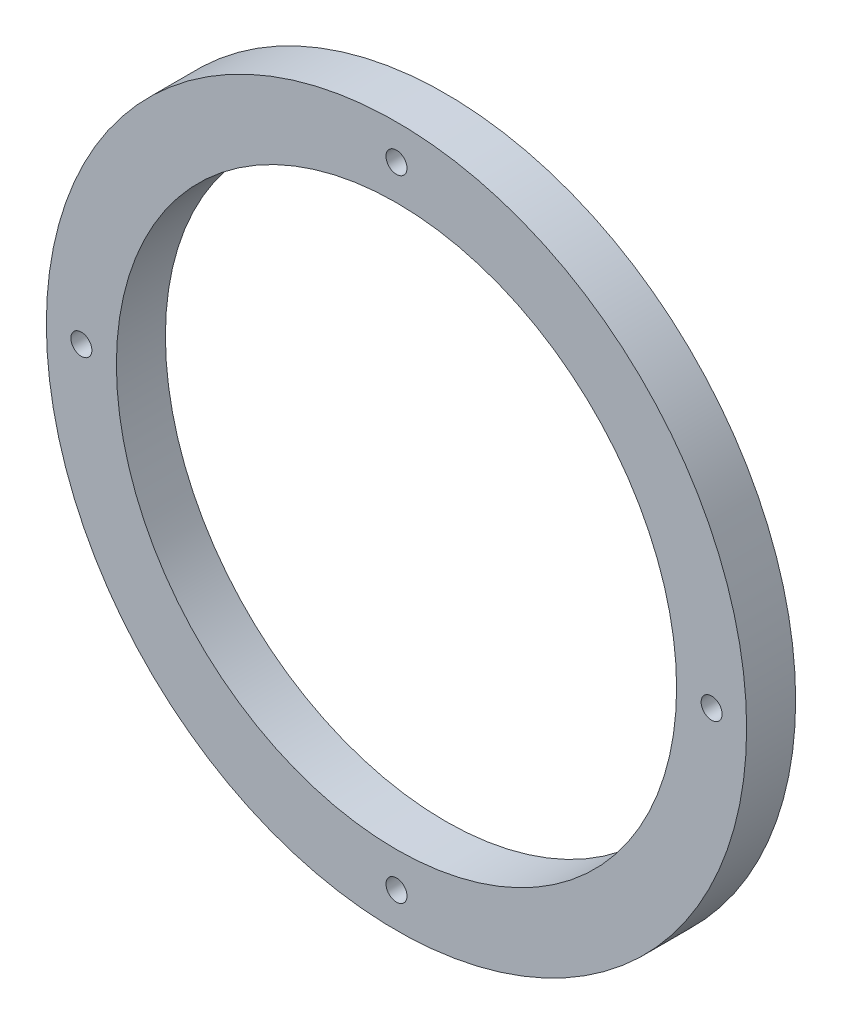
ISO-10303-21;
HEADER;
FILE_DESCRIPTION(('STEP AP214'),'2;1');
FILE_NAME('part.step','',(''),(''),'','','');
FILE_SCHEMA(('AUTOMOTIVE_DESIGN { 1 0 10303 214 1 1 1 1 }'));
ENDSEC;
DATA;
#1=APPLICATION_CONTEXT('core data for automotive mechanical design processes');
#2=APPLICATION_PROTOCOL_DEFINITION('international standard','automotive_design',2000,#1);
#3=PRODUCT_CONTEXT('',#1,'mechanical');
#4=PRODUCT('Part','Part','',(#3));
#5=PRODUCT_RELATED_PRODUCT_CATEGORY('part','',(#4));
#6=PRODUCT_DEFINITION_FORMATION('','',#4);
#7=PRODUCT_DEFINITION_CONTEXT('part definition',#1,'design');
#8=PRODUCT_DEFINITION('design','',#6,#7);
#9=PRODUCT_DEFINITION_SHAPE('','',#8);
#10=(LENGTH_UNIT() NAMED_UNIT(*) SI_UNIT(.MILLI.,.METRE.));
#11=(NAMED_UNIT(*) PLANE_ANGLE_UNIT() SI_UNIT($,.RADIAN.));
#12=(NAMED_UNIT(*) SI_UNIT($,.STERADIAN.) SOLID_ANGLE_UNIT());
#13=UNCERTAINTY_MEASURE_WITH_UNIT(LENGTH_MEASURE(1.E-05),#10,'distance_accuracy_value','');
#14=(GEOMETRIC_REPRESENTATION_CONTEXT(3) GLOBAL_UNCERTAINTY_ASSIGNED_CONTEXT((#13)) GLOBAL_UNIT_ASSIGNED_CONTEXT((#10,
#11,#12)) REPRESENTATION_CONTEXT('',''));
#15=CARTESIAN_POINT('',(0.,0.,0.));
#16=DIRECTION('',(0.,0.,1.));
#17=DIRECTION('',(1.,0.,0.));
#18=AXIS2_PLACEMENT_3D('',#15,#16,#17);
#19=CARTESIAN_POINT('',(0.,0.,7.));
#20=DIRECTION('',(0.,0.,1.));
#21=DIRECTION('',(1.,0.,0.));
#22=AXIS2_PLACEMENT_3D('',#19,#20,#21);
#23=PLANE('',#22);
#24=CARTESIAN_POINT('',(0.,45.,7.));
#25=DIRECTION('',(0.,0.,1.));
#26=DIRECTION('',(1.,0.,0.));
#27=AXIS2_PLACEMENT_3D('',#24,#25,#26);
#28=CIRCLE('',#27,1.5);
#29=CARTESIAN_POINT('',(1.5,45.,7.));
#30=VERTEX_POINT('',#29);
#31=EDGE_CURVE('E84',#30,#30,#28,.T.);
#32=ORIENTED_EDGE('',*,*,#31,.F.);
#33=EDGE_LOOP('',(#32));
#34=FACE_BOUND('',#33,.T.);
#35=CARTESIAN_POINT('',(0.,-45.,7.));
#36=DIRECTION('',(0.,0.,1.));
#37=DIRECTION('',(1.,0.,0.));
#38=AXIS2_PLACEMENT_3D('',#35,#36,#37);
#39=CIRCLE('',#38,1.5);
#40=CARTESIAN_POINT('',(1.5,-45.,7.));
#41=VERTEX_POINT('',#40);
#42=EDGE_CURVE('E76',#41,#41,#39,.T.);
#43=ORIENTED_EDGE('',*,*,#42,.F.);
#44=EDGE_LOOP('',(#43));
#45=FACE_BOUND('',#44,.T.);
#46=CARTESIAN_POINT('',(-45.,0.,7.));
#47=DIRECTION('',(0.,0.,1.));
#48=DIRECTION('',(1.,0.,0.));
#49=AXIS2_PLACEMENT_3D('',#46,#47,#48);
#50=CIRCLE('',#49,1.5);
#51=CARTESIAN_POINT('',(-43.5,0.,7.));
#52=VERTEX_POINT('',#51);
#53=EDGE_CURVE('E68',#52,#52,#50,.T.);
#54=ORIENTED_EDGE('',*,*,#53,.F.);
#55=EDGE_LOOP('',(#54));
#56=FACE_BOUND('',#55,.T.);
#57=CARTESIAN_POINT('',(45.,0.,7.));
#58=DIRECTION('',(0.,0.,1.));
#59=DIRECTION('',(1.,0.,0.));
#60=AXIS2_PLACEMENT_3D('',#57,#58,#59);
#61=CIRCLE('',#60,1.5);
#62=CARTESIAN_POINT('',(46.5,0.,7.));
#63=VERTEX_POINT('',#62);
#64=EDGE_CURVE('E60',#63,#63,#61,.T.);
#65=ORIENTED_EDGE('',*,*,#64,.F.);
#66=EDGE_LOOP('',(#65));
#67=FACE_BOUND('',#66,.T.);
#68=CARTESIAN_POINT('',(0.,0.,7.));
#69=DIRECTION('',(0.,0.,1.));
#70=DIRECTION('',(1.,0.,0.));
#71=AXIS2_PLACEMENT_3D('',#68,#69,#70);
#72=CIRCLE('',#71,50.);
#73=CARTESIAN_POINT('',(50.,0.,7.));
#74=VERTEX_POINT('',#73);
#75=EDGE_CURVE('E10',#74,#74,#72,.T.);
#76=ORIENTED_EDGE('',*,*,#75,.T.);
#77=EDGE_LOOP('',(#76));
#78=FACE_BOUND('',#77,.T.);
#79=CARTESIAN_POINT('',(0.,0.,7.));
#80=DIRECTION('',(0.,0.,1.));
#81=DIRECTION('',(1.,0.,0.));
#82=AXIS2_PLACEMENT_3D('',#79,#80,#81);
#83=CIRCLE('',#82,40.);
#84=CARTESIAN_POINT('',(40.,0.,7.));
#85=VERTEX_POINT('',#84);
#86=EDGE_CURVE('E50',#85,#85,#83,.T.);
#87=ORIENTED_EDGE('',*,*,#86,.F.);
#88=EDGE_LOOP('',(#87));
#89=FACE_BOUND('',#88,.T.);
#90=ADVANCED_FACE('F37',(#34,#45,#56,#67,#78,#89),#23,.T.);
#91=CARTESIAN_POINT('',(0.,0.,0.));
#92=DIRECTION('',(0.,0.,1.));
#93=DIRECTION('',(1.,0.,0.));
#94=AXIS2_PLACEMENT_3D('',#91,#92,#93);
#95=PLANE('',#94);
#96=CARTESIAN_POINT('',(0.,45.,0.));
#97=DIRECTION('',(0.,0.,1.));
#98=DIRECTION('',(1.,0.,0.));
#99=AXIS2_PLACEMENT_3D('',#96,#97,#98);
#100=CIRCLE('',#99,1.5);
#101=CARTESIAN_POINT('',(1.5,45.,0.));
#102=VERTEX_POINT('',#101);
#103=EDGE_CURVE('E56',#102,#102,#100,.T.);
#104=ORIENTED_EDGE('',*,*,#103,.T.);
#105=EDGE_LOOP('',(#104));
#106=FACE_BOUND('',#105,.T.);
#107=CARTESIAN_POINT('',(0.,-45.,0.));
#108=DIRECTION('',(0.,0.,1.));
#109=DIRECTION('',(1.,0.,0.));
#110=AXIS2_PLACEMENT_3D('',#107,#108,#109);
#111=CIRCLE('',#110,1.5);
#112=CARTESIAN_POINT('',(1.5,-45.,0.));
#113=VERTEX_POINT('',#112);
#114=EDGE_CURVE('E80',#113,#113,#111,.T.);
#115=ORIENTED_EDGE('',*,*,#114,.T.);
#116=EDGE_LOOP('',(#115));
#117=FACE_BOUND('',#116,.T.);
#118=CARTESIAN_POINT('',(-45.,0.,0.));
#119=DIRECTION('',(0.,0.,1.));
#120=DIRECTION('',(1.,0.,0.));
#121=AXIS2_PLACEMENT_3D('',#118,#119,#120);
#122=CIRCLE('',#121,1.5);
#123=CARTESIAN_POINT('',(-43.5,0.,0.));
#124=VERTEX_POINT('',#123);
#125=EDGE_CURVE('E72',#124,#124,#122,.T.);
#126=ORIENTED_EDGE('',*,*,#125,.T.);
#127=EDGE_LOOP('',(#126));
#128=FACE_BOUND('',#127,.T.);
#129=CARTESIAN_POINT('',(45.,0.,0.));
#130=DIRECTION('',(0.,0.,1.));
#131=DIRECTION('',(1.,0.,0.));
#132=AXIS2_PLACEMENT_3D('',#129,#130,#131);
#133=CIRCLE('',#132,1.5);
#134=CARTESIAN_POINT('',(46.5,0.,0.));
#135=VERTEX_POINT('',#134);
#136=EDGE_CURVE('E64',#135,#135,#133,.T.);
#137=ORIENTED_EDGE('',*,*,#136,.T.);
#138=EDGE_LOOP('',(#137));
#139=FACE_BOUND('',#138,.T.);
#140=CARTESIAN_POINT('',(0.,0.,0.));
#141=DIRECTION('',(0.,0.,1.));
#142=DIRECTION('',(1.,0.,0.));
#143=AXIS2_PLACEMENT_3D('',#140,#141,#142);
#144=CIRCLE('',#143,50.);
#145=CARTESIAN_POINT('',(50.,0.,0.));
#146=VERTEX_POINT('',#145);
#147=EDGE_CURVE('E41',#146,#146,#144,.T.);
#148=ORIENTED_EDGE('',*,*,#147,.F.);
#149=EDGE_LOOP('',(#148));
#150=FACE_BOUND('',#149,.T.);
#151=CARTESIAN_POINT('',(0.,0.,0.));
#152=DIRECTION('',(0.,0.,1.));
#153=DIRECTION('',(1.,0.,0.));
#154=AXIS2_PLACEMENT_3D('',#151,#152,#153);
#155=CIRCLE('',#154,40.);
#156=CARTESIAN_POINT('',(40.,0.,0.));
#157=VERTEX_POINT('',#156);
#158=EDGE_CURVE('E52',#157,#157,#155,.T.);
#159=ORIENTED_EDGE('',*,*,#158,.T.);
#160=EDGE_LOOP('',(#159));
#161=FACE_BOUND('',#160,.T.);
#162=ADVANCED_FACE('F92',(#106,#117,#128,#139,#150,#161),#95,.F.);
#163=CARTESIAN_POINT('',(0.,0.,7.));
#164=DIRECTION('',(0.,0.,-1.));
#165=DIRECTION('',(-1.,0.,0.));
#166=AXIS2_PLACEMENT_3D('',#163,#164,#165);
#167=CYLINDRICAL_SURFACE('',#166,50.);
#168=ORIENTED_EDGE('',*,*,#75,.F.);
#169=EDGE_LOOP('',(#168));
#170=FACE_BOUND('',#169,.T.);
#171=ORIENTED_EDGE('',*,*,#147,.T.);
#172=EDGE_LOOP('',(#171));
#173=FACE_BOUND('',#172,.T.);
#174=ADVANCED_FACE('F39',(#170,#173),#167,.T.);
#175=CARTESIAN_POINT('',(0.,0.,7.));
#176=DIRECTION('',(0.,0.,-1.));
#177=DIRECTION('',(-1.,0.,0.));
#178=AXIS2_PLACEMENT_3D('',#175,#176,#177);
#179=CYLINDRICAL_SURFACE('',#178,40.);
#180=ORIENTED_EDGE('',*,*,#86,.T.);
#181=EDGE_LOOP('',(#180));
#182=FACE_BOUND('',#181,.T.);
#183=ORIENTED_EDGE('',*,*,#158,.F.);
#184=EDGE_LOOP('',(#183));
#185=FACE_BOUND('',#184,.T.);
#186=ADVANCED_FACE('F113',(#182,#185),#179,.F.);
#187=CARTESIAN_POINT('',(45.,0.,0.));
#188=DIRECTION('',(0.,0.,1.));
#189=DIRECTION('',(1.,0.,0.));
#190=AXIS2_PLACEMENT_3D('',#187,#188,#189);
#191=CYLINDRICAL_SURFACE('',#190,1.5);
#192=ORIENTED_EDGE('',*,*,#136,.F.);
#193=EDGE_LOOP('',(#192));
#194=FACE_BOUND('',#193,.T.);
#195=ORIENTED_EDGE('',*,*,#64,.T.);
#196=EDGE_LOOP('',(#195));
#197=FACE_BOUND('',#196,.T.);
#198=ADVANCED_FACE('F116',(#194,#197),#191,.F.);
#199=CARTESIAN_POINT('',(-45.,0.,0.));
#200=DIRECTION('',(0.,0.,1.));
#201=DIRECTION('',(1.,0.,0.));
#202=AXIS2_PLACEMENT_3D('',#199,#200,#201);
#203=CYLINDRICAL_SURFACE('',#202,1.5);
#204=ORIENTED_EDGE('',*,*,#125,.F.);
#205=EDGE_LOOP('',(#204));
#206=FACE_BOUND('',#205,.T.);
#207=ORIENTED_EDGE('',*,*,#53,.T.);
#208=EDGE_LOOP('',(#207));
#209=FACE_BOUND('',#208,.T.);
#210=ADVANCED_FACE('F128',(#206,#209),#203,.F.);
#211=CARTESIAN_POINT('',(0.,-45.,0.));
#212=DIRECTION('',(0.,0.,1.));
#213=DIRECTION('',(1.,0.,0.));
#214=AXIS2_PLACEMENT_3D('',#211,#212,#213);
#215=CYLINDRICAL_SURFACE('',#214,1.5);
#216=ORIENTED_EDGE('',*,*,#114,.F.);
#217=EDGE_LOOP('',(#216));
#218=FACE_BOUND('',#217,.T.);
#219=ORIENTED_EDGE('',*,*,#42,.T.);
#220=EDGE_LOOP('',(#219));
#221=FACE_BOUND('',#220,.T.);
#222=ADVANCED_FACE('F98',(#218,#221),#215,.F.);
#223=CARTESIAN_POINT('',(0.,45.,0.));
#224=DIRECTION('',(0.,0.,1.));
#225=DIRECTION('',(1.,0.,0.));
#226=AXIS2_PLACEMENT_3D('',#223,#224,#225);
#227=CYLINDRICAL_SURFACE('',#226,1.5);
#228=ORIENTED_EDGE('',*,*,#103,.F.);
#229=EDGE_LOOP('',(#228));
#230=FACE_BOUND('',#229,.T.);
#231=ORIENTED_EDGE('',*,*,#31,.T.);
#232=EDGE_LOOP('',(#231));
#233=FACE_BOUND('',#232,.T.);
#234=ADVANCED_FACE('F95',(#230,#233),#227,.F.);
#235=CLOSED_SHELL('',(#90,#162,#174,#186,#198,#210,#222,#234));
#236=MANIFOLD_SOLID_BREP('B2',#235);
#237=ADVANCED_BREP_SHAPE_REPRESENTATION('',(#18,#236),#14);
#238=SHAPE_DEFINITION_REPRESENTATION(#9,#237);
ENDSEC;
END-ISO-10303-21;
